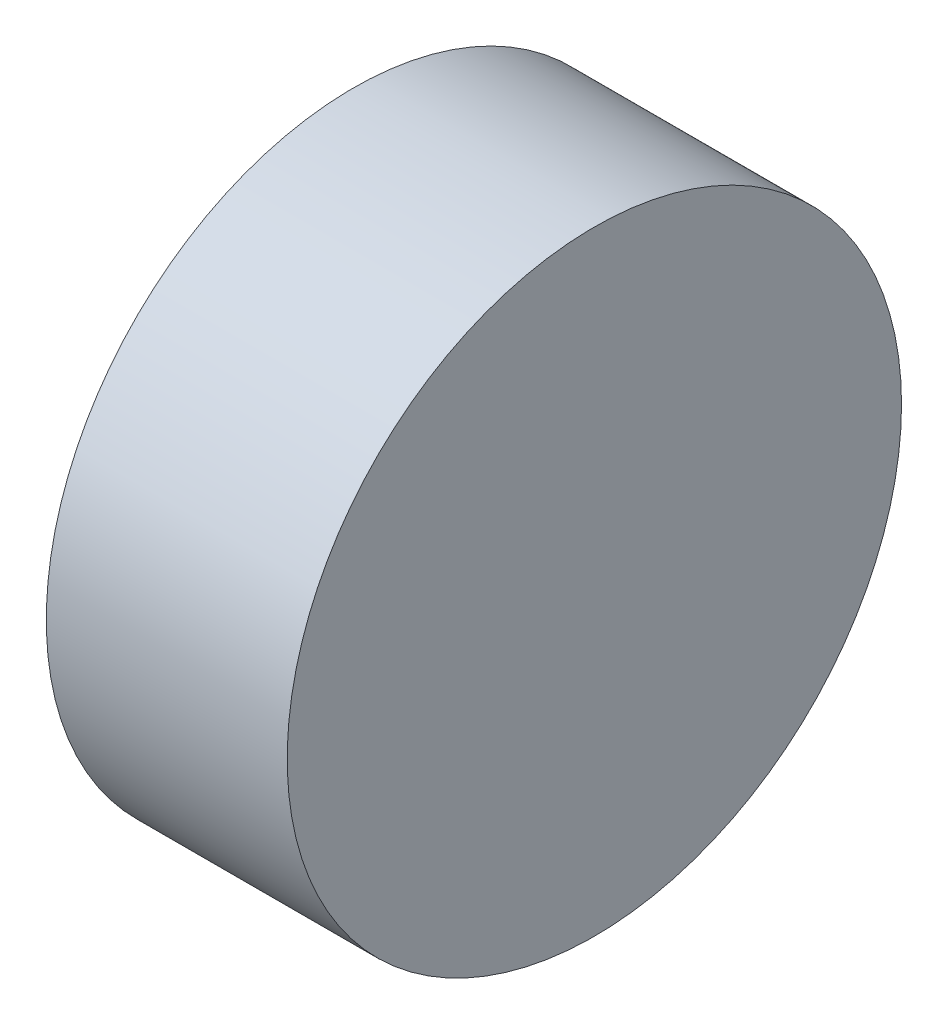
ISO-10303-21;
HEADER;
FILE_DESCRIPTION(('STEP AP214'),'2;1');
FILE_NAME('part.step','',(''),(''),'','','');
FILE_SCHEMA(('AUTOMOTIVE_DESIGN { 1 0 10303 214 1 1 1 1 }'));
ENDSEC;
DATA;
#1=APPLICATION_CONTEXT('core data for automotive mechanical design processes');
#2=APPLICATION_PROTOCOL_DEFINITION('international standard','automotive_design',2000,#1);
#3=PRODUCT_CONTEXT('',#1,'mechanical');
#4=PRODUCT('Part','Part','',(#3));
#5=PRODUCT_RELATED_PRODUCT_CATEGORY('part','',(#4));
#6=PRODUCT_DEFINITION_FORMATION('','',#4);
#7=PRODUCT_DEFINITION_CONTEXT('part definition',#1,'design');
#8=PRODUCT_DEFINITION('design','',#6,#7);
#9=PRODUCT_DEFINITION_SHAPE('','',#8);
#10=(LENGTH_UNIT() NAMED_UNIT(*) SI_UNIT(.MILLI.,.METRE.));
#11=(NAMED_UNIT(*) PLANE_ANGLE_UNIT() SI_UNIT($,.RADIAN.));
#12=(NAMED_UNIT(*) SI_UNIT($,.STERADIAN.) SOLID_ANGLE_UNIT());
#13=UNCERTAINTY_MEASURE_WITH_UNIT(LENGTH_MEASURE(1.E-05),#10,'distance_accuracy_value','');
#14=(GEOMETRIC_REPRESENTATION_CONTEXT(3) GLOBAL_UNCERTAINTY_ASSIGNED_CONTEXT((#13)) GLOBAL_UNIT_ASSIGNED_CONTEXT((#10,
#11,#12)) REPRESENTATION_CONTEXT('',''));
#15=CARTESIAN_POINT('',(0.,0.,0.));
#16=DIRECTION('',(0.,0.,1.));
#17=DIRECTION('',(1.,0.,0.));
#18=AXIS2_PLACEMENT_3D('',#15,#16,#17);
#19=CARTESIAN_POINT('',(40.,0.,0.));
#20=DIRECTION('',(-1.,0.,0.));
#21=DIRECTION('',(0.,0.,1.));
#22=AXIS2_PLACEMENT_3D('',#19,#20,#21);
#23=CYLINDRICAL_SURFACE('',#22,51.);
#24=CARTESIAN_POINT('',(40.,0.,0.));
#25=DIRECTION('',(1.,0.,0.));
#26=DIRECTION('',(0.,0.,-1.));
#27=AXIS2_PLACEMENT_3D('',#24,#25,#26);
#28=CIRCLE('',#27,51.);
#29=CARTESIAN_POINT('',(40.,0.,-51.));
#30=VERTEX_POINT('',#29);
#31=EDGE_CURVE('E45',#30,#30,#28,.T.);
#32=ORIENTED_EDGE('',*,*,#31,.F.);
#33=EDGE_LOOP('',(#32));
#34=FACE_BOUND('',#33,.T.);
#35=CARTESIAN_POINT('',(0.,0.,0.));
#36=DIRECTION('',(1.,0.,0.));
#37=DIRECTION('',(0.,0.,-1.));
#38=AXIS2_PLACEMENT_3D('',#35,#36,#37);
#39=CIRCLE('',#38,51.);
#40=CARTESIAN_POINT('',(0.,0.,-51.));
#41=VERTEX_POINT('',#40);
#42=EDGE_CURVE('E40',#41,#41,#39,.T.);
#43=ORIENTED_EDGE('',*,*,#42,.T.);
#44=EDGE_LOOP('',(#43));
#45=FACE_BOUND('',#44,.T.);
#46=ADVANCED_FACE('F37',(#34,#45),#23,.T.);
#47=CARTESIAN_POINT('',(40.,0.,0.));
#48=DIRECTION('',(1.,0.,0.));
#49=DIRECTION('',(0.,0.,-1.));
#50=AXIS2_PLACEMENT_3D('',#47,#48,#49);
#51=PLANE('',#50);
#52=ORIENTED_EDGE('',*,*,#31,.T.);
#53=EDGE_LOOP('',(#52));
#54=FACE_BOUND('',#53,.T.);
#55=ADVANCED_FACE('F65',(#54),#51,.T.);
#56=CARTESIAN_POINT('',(0.,0.,0.));
#57=DIRECTION('',(1.,0.,0.));
#58=DIRECTION('',(0.,0.,-1.));
#59=AXIS2_PLACEMENT_3D('',#56,#57,#58);
#60=PLANE('',#59);
#61=CARTESIAN_POINT('',(0.,0.,0.));
#62=DIRECTION('',(-1.,0.,0.));
#63=DIRECTION('',(0.,0.,1.));
#64=AXIS2_PLACEMENT_3D('',#61,#62,#63);
#65=CIRCLE('',#64,23.);
#66=CARTESIAN_POINT('',(0.,0.,23.));
#67=VERTEX_POINT('',#66);
#68=EDGE_CURVE('E10',#67,#67,#65,.T.);
#69=ORIENTED_EDGE('',*,*,#68,.F.);
#70=EDGE_LOOP('',(#69));
#71=FACE_BOUND('',#70,.T.);
#72=ORIENTED_EDGE('',*,*,#42,.F.);
#73=EDGE_LOOP('',(#72));
#74=FACE_BOUND('',#73,.T.);
#75=ADVANCED_FACE('F62',(#71,#74),#60,.F.);
#76=CARTESIAN_POINT('',(-10.,0.,0.));
#77=DIRECTION('',(1.,0.,0.));
#78=DIRECTION('',(0.,0.,-1.));
#79=AXIS2_PLACEMENT_3D('',#76,#77,#78);
#80=CYLINDRICAL_SURFACE('',#79,23.);
#81=CARTESIAN_POINT('',(-10.,0.,0.));
#82=DIRECTION('',(-1.,0.,0.));
#83=DIRECTION('',(0.,0.,1.));
#84=AXIS2_PLACEMENT_3D('',#81,#82,#83);
#85=CIRCLE('',#84,23.);
#86=CARTESIAN_POINT('',(-10.,0.,23.));
#87=VERTEX_POINT('',#86);
#88=EDGE_CURVE('E52',#87,#87,#85,.T.);
#89=ORIENTED_EDGE('',*,*,#88,.F.);
#90=EDGE_LOOP('',(#89));
#91=FACE_BOUND('',#90,.T.);
#92=ORIENTED_EDGE('',*,*,#68,.T.);
#93=EDGE_LOOP('',(#92));
#94=FACE_BOUND('',#93,.T.);
#95=ADVANCED_FACE('F64',(#91,#94),#80,.T.);
#96=CARTESIAN_POINT('',(-10.,0.,0.));
#97=DIRECTION('',(-1.,0.,0.));
#98=DIRECTION('',(0.,0.,1.));
#99=AXIS2_PLACEMENT_3D('',#96,#97,#98);
#100=PLANE('',#99);
#101=ORIENTED_EDGE('',*,*,#88,.T.);
#102=EDGE_LOOP('',(#101));
#103=FACE_BOUND('',#102,.T.);
#104=ADVANCED_FACE('F71',(#103),#100,.T.);
#105=CLOSED_SHELL('',(#46,#55,#75,#95,#104));
#106=MANIFOLD_SOLID_BREP('B2',#105);
#107=ADVANCED_BREP_SHAPE_REPRESENTATION('',(#18,#106),#14);
#108=SHAPE_DEFINITION_REPRESENTATION(#9,#107);
ENDSEC;
END-ISO-10303-21;
